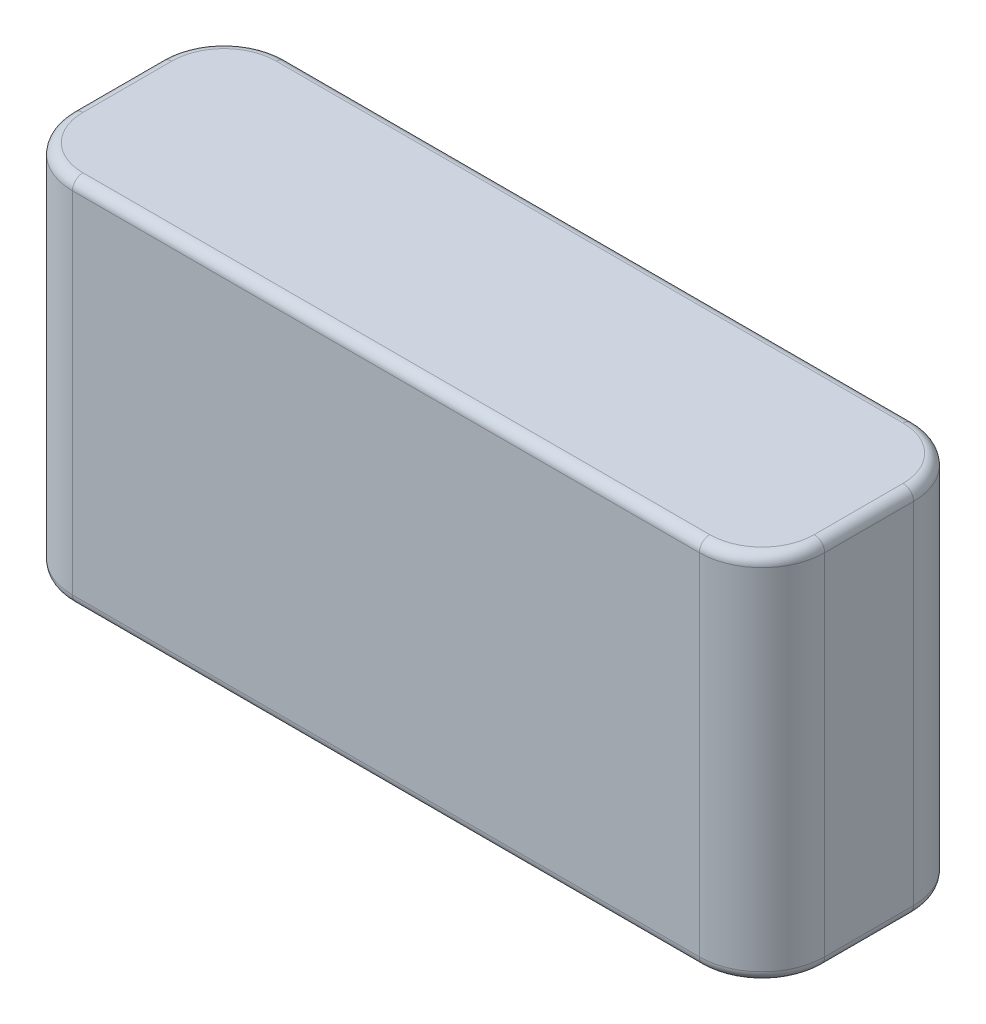
ISO-10303-21;
HEADER;
FILE_DESCRIPTION(('STEP AP214'),'2;1');
FILE_NAME('part.step','',(''),(''),'','','');
FILE_SCHEMA(('AUTOMOTIVE_DESIGN { 1 0 10303 214 1 1 1 1 }'));
ENDSEC;
DATA;
#1=APPLICATION_CONTEXT('core data for automotive mechanical design processes');
#2=APPLICATION_PROTOCOL_DEFINITION('international standard','automotive_design',2000,#1);
#3=PRODUCT_CONTEXT('',#1,'mechanical');
#4=PRODUCT('Part','Part','',(#3));
#5=PRODUCT_RELATED_PRODUCT_CATEGORY('part','',(#4));
#6=PRODUCT_DEFINITION_FORMATION('','',#4);
#7=PRODUCT_DEFINITION_CONTEXT('part definition',#1,'design');
#8=PRODUCT_DEFINITION('design','',#6,#7);
#9=PRODUCT_DEFINITION_SHAPE('','',#8);
#10=(LENGTH_UNIT() NAMED_UNIT(*) SI_UNIT(.MILLI.,.METRE.));
#11=(NAMED_UNIT(*) PLANE_ANGLE_UNIT() SI_UNIT($,.RADIAN.));
#12=(NAMED_UNIT(*) SI_UNIT($,.STERADIAN.) SOLID_ANGLE_UNIT());
#13=UNCERTAINTY_MEASURE_WITH_UNIT(LENGTH_MEASURE(1.E-05),#10,'distance_accuracy_value','');
#14=(GEOMETRIC_REPRESENTATION_CONTEXT(3) GLOBAL_UNCERTAINTY_ASSIGNED_CONTEXT((#13)) GLOBAL_UNIT_ASSIGNED_CONTEXT((#10,
#11,#12)) REPRESENTATION_CONTEXT('',''));
#15=CARTESIAN_POINT('',(0.,0.,0.));
#16=DIRECTION('',(0.,0.,1.));
#17=DIRECTION('',(1.,0.,0.));
#18=AXIS2_PLACEMENT_3D('',#15,#16,#17);
#19=CARTESIAN_POINT('',(36.,-17.75,20.5));
#20=DIRECTION('',(-1.,0.,0.));
#21=DIRECTION('',(0.,0.,1.));
#22=AXIS2_PLACEMENT_3D('',#19,#20,#21);
#23=PLANE('',#22);
#24=DIRECTION('',(0.,1.,0.));
#25=VECTOR('',#24,1.);
#26=CARTESIAN_POINT('',(36.,17.75,6.));
#27=LINE('',#26,#25);
#28=CARTESIAN_POINT('',(36.,-16.75,6.));
#29=VERTEX_POINT('',#28);
#30=CARTESIAN_POINT('',(36.,16.75,6.));
#31=VERTEX_POINT('',#30);
#32=EDGE_CURVE('E176',#29,#31,#27,.T.);
#33=ORIENTED_EDGE('',*,*,#32,.T.);
#34=DIRECTION('',(0.,0.,-1.));
#35=VECTOR('',#34,1.);
#36=CARTESIAN_POINT('',(36.,16.75,20.5));
#37=LINE('',#36,#35);
#38=CARTESIAN_POINT('',(36.,16.75,14.5));
#39=VERTEX_POINT('',#38);
#40=EDGE_CURVE('E197',#31,#39,#37,.F.);
#41=ORIENTED_EDGE('',*,*,#40,.T.);
#42=DIRECTION('',(0.,1.,0.));
#43=VECTOR('',#42,1.);
#44=CARTESIAN_POINT('',(36.,-17.75,14.5));
#45=LINE('',#44,#43);
#46=CARTESIAN_POINT('',(36.,-16.75,14.5));
#47=VERTEX_POINT('',#46);
#48=EDGE_CURVE('E350',#39,#47,#45,.F.);
#49=ORIENTED_EDGE('',*,*,#48,.T.);
#50=DIRECTION('',(0.,0.,-1.));
#51=VECTOR('',#50,1.);
#52=CARTESIAN_POINT('',(36.,-16.75,20.5));
#53=LINE('',#52,#51);
#54=EDGE_CURVE('E194',#47,#29,#53,.T.);
#55=ORIENTED_EDGE('',*,*,#54,.T.);
#56=EDGE_LOOP('',(#33,#41,#49,#55));
#57=FACE_BOUND('',#56,.T.);
#58=ADVANCED_FACE('F40',(#57),#23,.F.);
#59=CARTESIAN_POINT('',(-36.,17.75,20.5));
#60=DIRECTION('',(0.,-1.,0.));
#61=DIRECTION('',(0.,0.,-1.));
#62=AXIS2_PLACEMENT_3D('',#59,#60,#61);
#63=PLANE('',#62);
#64=DIRECTION('',(0.,0.,-1.));
#65=VECTOR('',#64,1.);
#66=CARTESIAN_POINT('',(35.,17.75,20.5));
#67=LINE('',#66,#65);
#68=CARTESIAN_POINT('',(35.,17.75,14.5));
#69=VERTEX_POINT('',#68);
#70=CARTESIAN_POINT('',(35.,17.75,6.));
#71=VERTEX_POINT('',#70);
#72=EDGE_CURVE('E180',#69,#71,#67,.T.);
#73=ORIENTED_EDGE('',*,*,#72,.T.);
#74=CARTESIAN_POINT('',(30.,17.75,6.));
#75=DIRECTION('',(0.,-1.,0.));
#76=DIRECTION('',(0.,0.,-1.));
#77=AXIS2_PLACEMENT_3D('',#74,#75,#76);
#78=CIRCLE('',#77,5.);
#79=CARTESIAN_POINT('',(30.,17.75,1.));
#80=VERTEX_POINT('',#79);
#81=EDGE_CURVE('E159',#71,#80,#78,.F.);
#82=ORIENTED_EDGE('',*,*,#81,.T.);
#83=DIRECTION('',(-1.,0.,0.));
#84=VECTOR('',#83,1.);
#85=CARTESIAN_POINT('',(-30.,17.75,1.));
#86=LINE('',#85,#84);
#87=CARTESIAN_POINT('',(-30.,17.75,1.));
#88=VERTEX_POINT('',#87);
#89=EDGE_CURVE('E168',#80,#88,#86,.T.);
#90=ORIENTED_EDGE('',*,*,#89,.T.);
#91=CARTESIAN_POINT('',(-30.,17.75,6.));
#92=DIRECTION('',(0.,-1.,0.));
#93=DIRECTION('',(0.,0.,-1.));
#94=AXIS2_PLACEMENT_3D('',#91,#92,#93);
#95=CIRCLE('',#94,5.);
#96=CARTESIAN_POINT('',(-35.,17.75,6.));
#97=VERTEX_POINT('',#96);
#98=EDGE_CURVE('E175',#88,#97,#95,.F.);
#99=ORIENTED_EDGE('',*,*,#98,.T.);
#100=DIRECTION('',(0.,0.,-1.));
#101=VECTOR('',#100,1.);
#102=CARTESIAN_POINT('',(-35.,17.75,20.5));
#103=LINE('',#102,#101);
#104=CARTESIAN_POINT('',(-35.,17.75,14.5));
#105=VERTEX_POINT('',#104);
#106=EDGE_CURVE('E358',#97,#105,#103,.F.);
#107=ORIENTED_EDGE('',*,*,#106,.T.);
#108=CARTESIAN_POINT('',(-30.,17.75,14.5));
#109=DIRECTION('',(0.,-1.,0.));
#110=DIRECTION('',(0.,0.,-1.));
#111=AXIS2_PLACEMENT_3D('',#108,#109,#110);
#112=CIRCLE('',#111,5.);
#113=CARTESIAN_POINT('',(-30.,17.75,19.5));
#114=VERTEX_POINT('',#113);
#115=EDGE_CURVE('E361',#105,#114,#112,.F.);
#116=ORIENTED_EDGE('',*,*,#115,.T.);
#117=DIRECTION('',(-1.,0.,0.));
#118=VECTOR('',#117,1.);
#119=CARTESIAN_POINT('',(-36.,17.75,19.5));
#120=LINE('',#119,#118);
#121=CARTESIAN_POINT('',(30.,17.75,19.5));
#122=VERTEX_POINT('',#121);
#123=EDGE_CURVE('E364',#114,#122,#120,.F.);
#124=ORIENTED_EDGE('',*,*,#123,.T.);
#125=CARTESIAN_POINT('',(30.,17.75,14.5));
#126=DIRECTION('',(0.,-1.,0.));
#127=DIRECTION('',(0.,0.,-1.));
#128=AXIS2_PLACEMENT_3D('',#125,#126,#127);
#129=CIRCLE('',#128,5.);
#130=EDGE_CURVE('E188',#122,#69,#129,.F.);
#131=ORIENTED_EDGE('',*,*,#130,.T.);
#132=EDGE_LOOP('',(#73,#82,#90,#99,#107,#116,#124,#131));
#133=FACE_BOUND('',#132,.T.);
#134=ADVANCED_FACE('F178',(#133),#63,.F.);
#135=CARTESIAN_POINT('',(-36.,-17.75,20.5));
#136=DIRECTION('',(1.,0.,0.));
#137=DIRECTION('',(0.,0.,-1.));
#138=AXIS2_PLACEMENT_3D('',#135,#136,#137);
#139=PLANE('',#138);
#140=DIRECTION('',(0.,-1.,0.));
#141=VECTOR('',#140,1.);
#142=CARTESIAN_POINT('',(-36.,-17.75,14.5));
#143=LINE('',#142,#141);
#144=CARTESIAN_POINT('',(-36.,-16.75,14.5));
#145=VERTEX_POINT('',#144);
#146=CARTESIAN_POINT('',(-36.,16.75,14.5));
#147=VERTEX_POINT('',#146);
#148=EDGE_CURVE('E280',#145,#147,#143,.F.);
#149=ORIENTED_EDGE('',*,*,#148,.T.);
#150=DIRECTION('',(0.,0.,-1.));
#151=VECTOR('',#150,1.);
#152=CARTESIAN_POINT('',(-36.,16.75,20.5));
#153=LINE('',#152,#151);
#154=CARTESIAN_POINT('',(-36.,16.75,6.));
#155=VERTEX_POINT('',#154);
#156=EDGE_CURVE('E222',#147,#155,#153,.T.);
#157=ORIENTED_EDGE('',*,*,#156,.T.);
#158=DIRECTION('',(0.,-1.,0.));
#159=VECTOR('',#158,1.);
#160=CARTESIAN_POINT('',(-36.,-17.75,6.));
#161=LINE('',#160,#159);
#162=CARTESIAN_POINT('',(-36.,-16.75,6.));
#163=VERTEX_POINT('',#162);
#164=EDGE_CURVE('E333',#155,#163,#161,.T.);
#165=ORIENTED_EDGE('',*,*,#164,.T.);
#166=DIRECTION('',(0.,0.,-1.));
#167=VECTOR('',#166,1.);
#168=CARTESIAN_POINT('',(-36.,-16.75,20.5));
#169=LINE('',#168,#167);
#170=EDGE_CURVE('E219',#163,#145,#169,.F.);
#171=ORIENTED_EDGE('',*,*,#170,.T.);
#172=EDGE_LOOP('',(#149,#157,#165,#171));
#173=FACE_BOUND('',#172,.T.);
#174=ADVANCED_FACE('F407',(#173),#139,.F.);
#175=CARTESIAN_POINT('',(-36.,-17.75,20.5));
#176=DIRECTION('',(0.,1.,0.));
#177=DIRECTION('',(0.,0.,1.));
#178=AXIS2_PLACEMENT_3D('',#175,#176,#177);
#179=PLANE('',#178);
#180=DIRECTION('',(1.,0.,0.));
#181=VECTOR('',#180,1.);
#182=CARTESIAN_POINT('',(-36.,-17.75,19.5));
#183=LINE('',#182,#181);
#184=CARTESIAN_POINT('',(30.,-17.75,19.5));
#185=VERTEX_POINT('',#184);
#186=CARTESIAN_POINT('',(-30.,-17.75,19.5));
#187=VERTEX_POINT('',#186);
#188=EDGE_CURVE('E50',#185,#187,#183,.F.);
#189=ORIENTED_EDGE('',*,*,#188,.T.);
#190=CARTESIAN_POINT('',(-30.,-17.75,14.5));
#191=DIRECTION('',(0.,1.,0.));
#192=DIRECTION('',(0.,0.,1.));
#193=AXIS2_PLACEMENT_3D('',#190,#191,#192);
#194=CIRCLE('',#193,5.);
#195=CARTESIAN_POINT('',(-35.,-17.75,14.5));
#196=VERTEX_POINT('',#195);
#197=EDGE_CURVE('E11',#187,#196,#194,.F.);
#198=ORIENTED_EDGE('',*,*,#197,.T.);
#199=DIRECTION('',(0.,0.,-1.));
#200=VECTOR('',#199,1.);
#201=CARTESIAN_POINT('',(-35.,-17.75,20.5));
#202=LINE('',#201,#200);
#203=CARTESIAN_POINT('',(-35.,-17.75,6.));
#204=VERTEX_POINT('',#203);
#205=EDGE_CURVE('E237',#196,#204,#202,.T.);
#206=ORIENTED_EDGE('',*,*,#205,.T.);
#207=CARTESIAN_POINT('',(-30.,-17.75,6.));
#208=DIRECTION('',(0.,1.,0.));
#209=DIRECTION('',(0.,0.,1.));
#210=AXIS2_PLACEMENT_3D('',#207,#208,#209);
#211=CIRCLE('',#210,5.);
#212=CARTESIAN_POINT('',(-30.,-17.75,1.));
#213=VERTEX_POINT('',#212);
#214=EDGE_CURVE('E240',#204,#213,#211,.F.);
#215=ORIENTED_EDGE('',*,*,#214,.T.);
#216=DIRECTION('',(1.,0.,0.));
#217=VECTOR('',#216,1.);
#218=CARTESIAN_POINT('',(30.,-17.75,1.));
#219=LINE('',#218,#217);
#220=CARTESIAN_POINT('',(30.,-17.75,1.));
#221=VERTEX_POINT('',#220);
#222=EDGE_CURVE('E243',#213,#221,#219,.T.);
#223=ORIENTED_EDGE('',*,*,#222,.T.);
#224=CARTESIAN_POINT('',(30.,-17.75,6.));
#225=DIRECTION('',(0.,1.,0.));
#226=DIRECTION('',(0.,0.,1.));
#227=AXIS2_PLACEMENT_3D('',#224,#225,#226);
#228=CIRCLE('',#227,5.);
#229=CARTESIAN_POINT('',(35.,-17.75,6.));
#230=VERTEX_POINT('',#229);
#231=EDGE_CURVE('E246',#221,#230,#228,.F.);
#232=ORIENTED_EDGE('',*,*,#231,.T.);
#233=DIRECTION('',(0.,0.,-1.));
#234=VECTOR('',#233,1.);
#235=CARTESIAN_POINT('',(35.,-17.75,20.5));
#236=LINE('',#235,#234);
#237=CARTESIAN_POINT('',(35.,-17.75,14.5));
#238=VERTEX_POINT('',#237);
#239=EDGE_CURVE('E249',#230,#238,#236,.F.);
#240=ORIENTED_EDGE('',*,*,#239,.T.);
#241=CARTESIAN_POINT('',(30.,-17.75,14.5));
#242=DIRECTION('',(0.,1.,0.));
#243=DIRECTION('',(0.,0.,1.));
#244=AXIS2_PLACEMENT_3D('',#241,#242,#243);
#245=CIRCLE('',#244,5.);
#246=EDGE_CURVE('E61',#238,#185,#245,.F.);
#247=ORIENTED_EDGE('',*,*,#246,.T.);
#248=EDGE_LOOP('',(#189,#198,#206,#215,#223,#232,#240,#247));
#249=FACE_BOUND('',#248,.T.);
#250=ADVANCED_FACE('F394',(#249),#179,.F.);
#251=CARTESIAN_POINT('',(0.,0.,20.5));
#252=DIRECTION('',(0.,0.,-1.));
#253=DIRECTION('',(-1.,0.,0.));
#254=AXIS2_PLACEMENT_3D('',#251,#252,#253);
#255=PLANE('',#254);
#256=DIRECTION('',(0.,1.,0.));
#257=VECTOR('',#256,1.);
#258=CARTESIAN_POINT('',(30.,0.,20.5));
#259=LINE('',#258,#257);
#260=CARTESIAN_POINT('',(30.,-16.75,20.5));
#261=VERTEX_POINT('',#260);
#262=CARTESIAN_POINT('',(30.,16.75,20.5));
#263=VERTEX_POINT('',#262);
#264=EDGE_CURVE('E337',#261,#263,#259,.T.);
#265=ORIENTED_EDGE('',*,*,#264,.T.);
#266=DIRECTION('',(-1.,0.,0.));
#267=VECTOR('',#266,1.);
#268=CARTESIAN_POINT('',(0.,16.75,20.5));
#269=LINE('',#268,#267);
#270=CARTESIAN_POINT('',(-30.,16.75,20.5));
#271=VERTEX_POINT('',#270);
#272=EDGE_CURVE('E209',#263,#271,#269,.T.);
#273=ORIENTED_EDGE('',*,*,#272,.T.);
#274=DIRECTION('',(0.,-1.,0.));
#275=VECTOR('',#274,1.);
#276=CARTESIAN_POINT('',(-30.,0.,20.5));
#277=LINE('',#276,#275);
#278=CARTESIAN_POINT('',(-30.,-16.75,20.5));
#279=VERTEX_POINT('',#278);
#280=EDGE_CURVE('E346',#271,#279,#277,.T.);
#281=ORIENTED_EDGE('',*,*,#280,.T.);
#282=DIRECTION('',(1.,0.,0.));
#283=VECTOR('',#282,1.);
#284=CARTESIAN_POINT('',(0.,-16.75,20.5));
#285=LINE('',#284,#283);
#286=EDGE_CURVE('E206',#279,#261,#285,.T.);
#287=ORIENTED_EDGE('',*,*,#286,.T.);
#288=EDGE_LOOP('',(#265,#273,#281,#287));
#289=FACE_BOUND('',#288,.T.);
#290=ADVANCED_FACE('F424',(#289),#255,.F.);
#291=CARTESIAN_POINT('',(0.,0.,0.));
#292=DIRECTION('',(0.,0.,-1.));
#293=DIRECTION('',(-1.,0.,0.));
#294=AXIS2_PLACEMENT_3D('',#291,#292,#293);
#295=PLANE('',#294);
#296=DIRECTION('',(0.,-1.,0.));
#297=VECTOR('',#296,1.);
#298=CARTESIAN_POINT('',(-30.,17.75,0.));
#299=LINE('',#298,#297);
#300=CARTESIAN_POINT('',(-30.,-16.75,0.));
#301=VERTEX_POINT('',#300);
#302=CARTESIAN_POINT('',(-30.,16.75,0.));
#303=VERTEX_POINT('',#302);
#304=EDGE_CURVE('E332',#301,#303,#299,.F.);
#305=ORIENTED_EDGE('',*,*,#304,.T.);
#306=DIRECTION('',(-1.,0.,0.));
#307=VECTOR('',#306,1.);
#308=CARTESIAN_POINT('',(30.,16.75,0.));
#309=LINE('',#308,#307);
#310=CARTESIAN_POINT('',(30.,16.75,0.));
#311=VERTEX_POINT('',#310);
#312=EDGE_CURVE('E234',#303,#311,#309,.F.);
#313=ORIENTED_EDGE('',*,*,#312,.T.);
#314=DIRECTION('',(0.,1.,0.));
#315=VECTOR('',#314,1.);
#316=CARTESIAN_POINT('',(30.,-17.75,0.));
#317=LINE('',#316,#315);
#318=CARTESIAN_POINT('',(30.,-16.75,0.));
#319=VERTEX_POINT('',#318);
#320=EDGE_CURVE('E325',#311,#319,#317,.F.);
#321=ORIENTED_EDGE('',*,*,#320,.T.);
#322=DIRECTION('',(1.,0.,0.));
#323=VECTOR('',#322,1.);
#324=CARTESIAN_POINT('',(-30.,-16.75,0.));
#325=LINE('',#324,#323);
#326=EDGE_CURVE('E231',#319,#301,#325,.F.);
#327=ORIENTED_EDGE('',*,*,#326,.T.);
#328=EDGE_LOOP('',(#305,#313,#321,#327));
#329=FACE_BOUND('',#328,.T.);
#330=ADVANCED_FACE('F329',(#329),#295,.T.);
#331=CARTESIAN_POINT('',(-30.,-17.75,6.));
#332=DIRECTION('',(0.,1.,0.));
#333=DIRECTION('',(0.,0.,1.));
#334=AXIS2_PLACEMENT_3D('',#331,#332,#333);
#335=CYLINDRICAL_SURFACE('',#334,6.);
#336=ORIENTED_EDGE('',*,*,#164,.F.);
#337=CARTESIAN_POINT('',(-30.,16.75,6.));
#338=DIRECTION('',(0.,-1.,0.));
#339=DIRECTION('',(0.,0.,-1.));
#340=AXIS2_PLACEMENT_3D('',#337,#338,#339);
#341=CIRCLE('',#340,6.);
#342=EDGE_CURVE('E228',#155,#303,#341,.T.);
#343=ORIENTED_EDGE('',*,*,#342,.T.);
#344=ORIENTED_EDGE('',*,*,#304,.F.);
#345=CARTESIAN_POINT('',(-30.,-16.75,6.));
#346=DIRECTION('',(0.,1.,0.));
#347=DIRECTION('',(0.,0.,1.));
#348=AXIS2_PLACEMENT_3D('',#345,#346,#347);
#349=CIRCLE('',#348,6.);
#350=EDGE_CURVE('E225',#301,#163,#349,.T.);
#351=ORIENTED_EDGE('',*,*,#350,.T.);
#352=EDGE_LOOP('',(#336,#343,#344,#351));
#353=FACE_BOUND('',#352,.T.);
#354=ADVANCED_FACE('F432',(#353),#335,.T.);
#355=CARTESIAN_POINT('',(-30.,0.,14.5));
#356=DIRECTION('',(0.,-1.,0.));
#357=DIRECTION('',(0.,0.,-1.));
#358=AXIS2_PLACEMENT_3D('',#355,#356,#357);
#359=CYLINDRICAL_SURFACE('',#358,6.);
#360=ORIENTED_EDGE('',*,*,#280,.F.);
#361=CARTESIAN_POINT('',(-30.,16.75,14.5));
#362=DIRECTION('',(0.,-1.,0.));
#363=DIRECTION('',(0.,0.,-1.));
#364=AXIS2_PLACEMENT_3D('',#361,#362,#363);
#365=CIRCLE('',#364,6.);
#366=EDGE_CURVE('E216',#271,#147,#365,.T.);
#367=ORIENTED_EDGE('',*,*,#366,.T.);
#368=ORIENTED_EDGE('',*,*,#148,.F.);
#369=CARTESIAN_POINT('',(-30.,-16.75,14.5));
#370=DIRECTION('',(0.,1.,0.));
#371=DIRECTION('',(0.,0.,1.));
#372=AXIS2_PLACEMENT_3D('',#369,#370,#371);
#373=CIRCLE('',#372,6.);
#374=EDGE_CURVE('E212',#145,#279,#373,.T.);
#375=ORIENTED_EDGE('',*,*,#374,.T.);
#376=EDGE_LOOP('',(#360,#367,#368,#375));
#377=FACE_BOUND('',#376,.T.);
#378=ADVANCED_FACE('F412',(#377),#359,.T.);
#379=CARTESIAN_POINT('',(30.,-17.75,6.));
#380=DIRECTION('',(0.,-1.,0.));
#381=DIRECTION('',(0.,0.,-1.));
#382=AXIS2_PLACEMENT_3D('',#379,#380,#381);
#383=CYLINDRICAL_SURFACE('',#382,6.);
#384=ORIENTED_EDGE('',*,*,#320,.F.);
#385=CARTESIAN_POINT('',(30.,16.75,6.));
#386=DIRECTION('',(0.,-1.,0.));
#387=DIRECTION('',(0.,0.,-1.));
#388=AXIS2_PLACEMENT_3D('',#385,#386,#387);
#389=CIRCLE('',#388,6.);
#390=EDGE_CURVE('E161',#311,#31,#389,.T.);
#391=ORIENTED_EDGE('',*,*,#390,.T.);
#392=ORIENTED_EDGE('',*,*,#32,.F.);
#393=CARTESIAN_POINT('',(30.,-16.75,6.));
#394=DIRECTION('',(0.,1.,0.));
#395=DIRECTION('',(0.,0.,1.));
#396=AXIS2_PLACEMENT_3D('',#393,#394,#395);
#397=CIRCLE('',#396,6.);
#398=EDGE_CURVE('E183',#29,#319,#397,.T.);
#399=ORIENTED_EDGE('',*,*,#398,.T.);
#400=EDGE_LOOP('',(#384,#391,#392,#399));
#401=FACE_BOUND('',#400,.T.);
#402=ADVANCED_FACE('F324',(#401),#383,.T.);
#403=CARTESIAN_POINT('',(30.,0.,14.5));
#404=DIRECTION('',(0.,1.,0.));
#405=DIRECTION('',(0.,0.,1.));
#406=AXIS2_PLACEMENT_3D('',#403,#404,#405);
#407=CYLINDRICAL_SURFACE('',#406,6.);
#408=ORIENTED_EDGE('',*,*,#48,.F.);
#409=CARTESIAN_POINT('',(30.,16.75,14.5));
#410=DIRECTION('',(0.,-1.,0.));
#411=DIRECTION('',(0.,0.,-1.));
#412=AXIS2_PLACEMENT_3D('',#409,#410,#411);
#413=CIRCLE('',#412,6.);
#414=EDGE_CURVE('E203',#39,#263,#413,.T.);
#415=ORIENTED_EDGE('',*,*,#414,.T.);
#416=ORIENTED_EDGE('',*,*,#264,.F.);
#417=CARTESIAN_POINT('',(30.,-16.75,14.5));
#418=DIRECTION('',(0.,1.,0.));
#419=DIRECTION('',(0.,0.,1.));
#420=AXIS2_PLACEMENT_3D('',#417,#418,#419);
#421=CIRCLE('',#420,6.);
#422=EDGE_CURVE('E200',#261,#47,#421,.T.);
#423=ORIENTED_EDGE('',*,*,#422,.T.);
#424=EDGE_LOOP('',(#408,#415,#416,#423));
#425=FACE_BOUND('',#424,.T.);
#426=ADVANCED_FACE('F380',(#425),#407,.T.);
#427=CARTESIAN_POINT('',(-30.,16.75,14.5));
#428=DIRECTION('',(0.,-1.,0.));
#429=DIRECTION('',(0.,0.,-1.));
#430=AXIS2_PLACEMENT_3D('',#427,#428,#429);
#431=TOROIDAL_SURFACE('',#430,5.,1.);
#432=CARTESIAN_POINT('',(-35.,16.75,14.5));
#433=DIRECTION('',(0.,0.,-1.));
#434=DIRECTION('',(-1.,0.,0.));
#435=AXIS2_PLACEMENT_3D('',#432,#433,#434);
#436=CIRCLE('',#435,1.);
#437=EDGE_CURVE('E272',#147,#105,#436,.T.);
#438=ORIENTED_EDGE('',*,*,#437,.F.);
#439=ORIENTED_EDGE('',*,*,#366,.F.);
#440=CARTESIAN_POINT('',(-30.,16.75,19.5));
#441=DIRECTION('',(1.,0.,0.));
#442=DIRECTION('',(0.,0.,-1.));
#443=AXIS2_PLACEMENT_3D('',#440,#441,#442);
#444=CIRCLE('',#443,1.);
#445=EDGE_CURVE('E276',#114,#271,#444,.T.);
#446=ORIENTED_EDGE('',*,*,#445,.F.);
#447=ORIENTED_EDGE('',*,*,#115,.F.);
#448=EDGE_LOOP('',(#438,#439,#446,#447));
#449=FACE_BOUND('',#448,.T.);
#450=ADVANCED_FACE('F417',(#449),#431,.T.);
#451=CARTESIAN_POINT('',(0.,16.75,19.5));
#452=DIRECTION('',(-1.,0.,0.));
#453=DIRECTION('',(0.,0.,1.));
#454=AXIS2_PLACEMENT_3D('',#451,#452,#453);
#455=CYLINDRICAL_SURFACE('',#454,1.);
#456=ORIENTED_EDGE('',*,*,#445,.T.);
#457=ORIENTED_EDGE('',*,*,#272,.F.);
#458=CARTESIAN_POINT('',(30.,16.75,19.5));
#459=DIRECTION('',(1.,0.,0.));
#460=DIRECTION('',(0.,0.,-1.));
#461=AXIS2_PLACEMENT_3D('',#458,#459,#460);
#462=CIRCLE('',#461,1.);
#463=EDGE_CURVE('E268',#122,#263,#462,.T.);
#464=ORIENTED_EDGE('',*,*,#463,.F.);
#465=ORIENTED_EDGE('',*,*,#123,.F.);
#466=EDGE_LOOP('',(#456,#457,#464,#465));
#467=FACE_BOUND('',#466,.T.);
#468=ADVANCED_FACE('F422',(#467),#455,.T.);
#469=CARTESIAN_POINT('',(-35.,16.75,20.5));
#470=DIRECTION('',(0.,0.,-1.));
#471=DIRECTION('',(-1.,0.,0.));
#472=AXIS2_PLACEMENT_3D('',#469,#470,#471);
#473=CYLINDRICAL_SURFACE('',#472,1.);
#474=ORIENTED_EDGE('',*,*,#437,.T.);
#475=ORIENTED_EDGE('',*,*,#106,.F.);
#476=CARTESIAN_POINT('',(-35.,16.75,6.));
#477=DIRECTION('',(0.,0.,-1.));
#478=DIRECTION('',(-1.,0.,0.));
#479=AXIS2_PLACEMENT_3D('',#476,#477,#478);
#480=CIRCLE('',#479,1.);
#481=EDGE_CURVE('E264',#155,#97,#480,.T.);
#482=ORIENTED_EDGE('',*,*,#481,.F.);
#483=ORIENTED_EDGE('',*,*,#156,.F.);
#484=EDGE_LOOP('',(#474,#475,#482,#483));
#485=FACE_BOUND('',#484,.T.);
#486=ADVANCED_FACE('F465',(#485),#473,.T.);
#487=CARTESIAN_POINT('',(30.,16.75,14.5));
#488=DIRECTION('',(0.,-1.,0.));
#489=DIRECTION('',(0.,0.,-1.));
#490=AXIS2_PLACEMENT_3D('',#487,#488,#489);
#491=TOROIDAL_SURFACE('',#490,5.,1.);
#492=ORIENTED_EDGE('',*,*,#463,.T.);
#493=ORIENTED_EDGE('',*,*,#414,.F.);
#494=CARTESIAN_POINT('',(35.,16.75,14.5));
#495=DIRECTION('',(0.,0.,-1.));
#496=DIRECTION('',(-1.,0.,0.));
#497=AXIS2_PLACEMENT_3D('',#494,#495,#496);
#498=CIRCLE('',#497,1.);
#499=EDGE_CURVE('E260',#69,#39,#498,.T.);
#500=ORIENTED_EDGE('',*,*,#499,.F.);
#501=ORIENTED_EDGE('',*,*,#130,.F.);
#502=EDGE_LOOP('',(#492,#493,#500,#501));
#503=FACE_BOUND('',#502,.T.);
#504=ADVANCED_FACE('F373',(#503),#491,.T.);
#505=CARTESIAN_POINT('',(-30.,16.75,6.));
#506=DIRECTION('',(0.,-1.,0.));
#507=DIRECTION('',(0.,0.,-1.));
#508=AXIS2_PLACEMENT_3D('',#505,#506,#507);
#509=TOROIDAL_SURFACE('',#508,5.,1.);
#510=ORIENTED_EDGE('',*,*,#481,.T.);
#511=ORIENTED_EDGE('',*,*,#98,.F.);
#512=CARTESIAN_POINT('',(-30.,16.75,1.));
#513=DIRECTION('',(1.,0.,0.));
#514=DIRECTION('',(0.,0.,-1.));
#515=AXIS2_PLACEMENT_3D('',#512,#513,#514);
#516=CIRCLE('',#515,1.);
#517=EDGE_CURVE('E171',#303,#88,#516,.T.);
#518=ORIENTED_EDGE('',*,*,#517,.F.);
#519=ORIENTED_EDGE('',*,*,#342,.F.);
#520=EDGE_LOOP('',(#510,#511,#518,#519));
#521=FACE_BOUND('',#520,.T.);
#522=ADVANCED_FACE('F459',(#521),#509,.T.);
#523=CARTESIAN_POINT('',(35.,16.75,20.5));
#524=DIRECTION('',(0.,0.,-1.));
#525=DIRECTION('',(-1.,0.,0.));
#526=AXIS2_PLACEMENT_3D('',#523,#524,#525);
#527=CYLINDRICAL_SURFACE('',#526,1.);
#528=ORIENTED_EDGE('',*,*,#499,.T.);
#529=ORIENTED_EDGE('',*,*,#40,.F.);
#530=CARTESIAN_POINT('',(35.,16.75,6.));
#531=DIRECTION('',(0.,0.,-1.));
#532=DIRECTION('',(-1.,0.,0.));
#533=AXIS2_PLACEMENT_3D('',#530,#531,#532);
#534=CIRCLE('',#533,1.);
#535=EDGE_CURVE('E165',#71,#31,#534,.T.);
#536=ORIENTED_EDGE('',*,*,#535,.F.);
#537=ORIENTED_EDGE('',*,*,#72,.F.);
#538=EDGE_LOOP('',(#528,#529,#536,#537));
#539=FACE_BOUND('',#538,.T.);
#540=ADVANCED_FACE('F376',(#539),#527,.T.);
#541=CARTESIAN_POINT('',(-36.,16.75,1.));
#542=DIRECTION('',(1.,0.,0.));
#543=DIRECTION('',(0.,0.,-1.));
#544=AXIS2_PLACEMENT_3D('',#541,#542,#543);
#545=CYLINDRICAL_SURFACE('',#544,1.);
#546=ORIENTED_EDGE('',*,*,#517,.T.);
#547=ORIENTED_EDGE('',*,*,#89,.F.);
#548=CARTESIAN_POINT('',(30.,16.75,1.));
#549=DIRECTION('',(1.,0.,0.));
#550=DIRECTION('',(0.,0.,-1.));
#551=AXIS2_PLACEMENT_3D('',#548,#549,#550);
#552=CIRCLE('',#551,1.);
#553=EDGE_CURVE('E155',#311,#80,#552,.T.);
#554=ORIENTED_EDGE('',*,*,#553,.F.);
#555=ORIENTED_EDGE('',*,*,#312,.F.);
#556=EDGE_LOOP('',(#546,#547,#554,#555));
#557=FACE_BOUND('',#556,.T.);
#558=ADVANCED_FACE('F169',(#557),#545,.T.);
#559=CARTESIAN_POINT('',(30.,16.75,6.));
#560=DIRECTION('',(0.,-1.,0.));
#561=DIRECTION('',(0.,0.,-1.));
#562=AXIS2_PLACEMENT_3D('',#559,#560,#561);
#563=TOROIDAL_SURFACE('',#562,5.,1.);
#564=ORIENTED_EDGE('',*,*,#535,.T.);
#565=ORIENTED_EDGE('',*,*,#390,.F.);
#566=ORIENTED_EDGE('',*,*,#553,.T.);
#567=ORIENTED_EDGE('',*,*,#81,.F.);
#568=EDGE_LOOP('',(#564,#565,#566,#567));
#569=FACE_BOUND('',#568,.T.);
#570=ADVANCED_FACE('F157',(#569),#563,.T.);
#571=CARTESIAN_POINT('',(30.,-16.75,6.));
#572=DIRECTION('',(0.,1.,0.));
#573=DIRECTION('',(0.,0.,1.));
#574=AXIS2_PLACEMENT_3D('',#571,#572,#573);
#575=TOROIDAL_SURFACE('',#574,5.,1.);
#576=CARTESIAN_POINT('',(30.,-16.75,1.));
#577=DIRECTION('',(-1.,0.,0.));
#578=DIRECTION('',(0.,0.,1.));
#579=AXIS2_PLACEMENT_3D('',#576,#577,#578);
#580=CIRCLE('',#579,1.);
#581=EDGE_CURVE('E302',#319,#221,#580,.T.);
#582=ORIENTED_EDGE('',*,*,#581,.F.);
#583=ORIENTED_EDGE('',*,*,#398,.F.);
#584=CARTESIAN_POINT('',(35.,-16.75,6.));
#585=DIRECTION('',(0.,0.,1.));
#586=DIRECTION('',(1.,0.,0.));
#587=AXIS2_PLACEMENT_3D('',#584,#585,#586);
#588=CIRCLE('',#587,1.);
#589=EDGE_CURVE('E44',#230,#29,#588,.T.);
#590=ORIENTED_EDGE('',*,*,#589,.F.);
#591=ORIENTED_EDGE('',*,*,#231,.F.);
#592=EDGE_LOOP('',(#582,#583,#590,#591));
#593=FACE_BOUND('',#592,.T.);
#594=ADVANCED_FACE('F42',(#593),#575,.T.);
#595=CARTESIAN_POINT('',(35.,-16.75,20.5));
#596=DIRECTION('',(0.,0.,-1.));
#597=DIRECTION('',(-1.,0.,0.));
#598=AXIS2_PLACEMENT_3D('',#595,#596,#597);
#599=CYLINDRICAL_SURFACE('',#598,1.);
#600=ORIENTED_EDGE('',*,*,#589,.T.);
#601=ORIENTED_EDGE('',*,*,#54,.F.);
#602=CARTESIAN_POINT('',(35.,-16.75,14.5));
#603=DIRECTION('',(0.,0.,1.));
#604=DIRECTION('',(1.,0.,0.));
#605=AXIS2_PLACEMENT_3D('',#602,#603,#604);
#606=CIRCLE('',#605,1.);
#607=EDGE_CURVE('E299',#238,#47,#606,.T.);
#608=ORIENTED_EDGE('',*,*,#607,.F.);
#609=ORIENTED_EDGE('',*,*,#239,.F.);
#610=EDGE_LOOP('',(#600,#601,#608,#609));
#611=FACE_BOUND('',#610,.T.);
#612=ADVANCED_FACE('F315',(#611),#599,.T.);
#613=CARTESIAN_POINT('',(-36.,-16.75,1.));
#614=DIRECTION('',(-1.,0.,0.));
#615=DIRECTION('',(0.,0.,1.));
#616=AXIS2_PLACEMENT_3D('',#613,#614,#615);
#617=CYLINDRICAL_SURFACE('',#616,1.);
#618=ORIENTED_EDGE('',*,*,#581,.T.);
#619=ORIENTED_EDGE('',*,*,#222,.F.);
#620=CARTESIAN_POINT('',(-30.,-16.75,1.));
#621=DIRECTION('',(-1.,0.,0.));
#622=DIRECTION('',(0.,0.,1.));
#623=AXIS2_PLACEMENT_3D('',#620,#621,#622);
#624=CIRCLE('',#623,1.);
#625=EDGE_CURVE('E295',#301,#213,#624,.T.);
#626=ORIENTED_EDGE('',*,*,#625,.F.);
#627=ORIENTED_EDGE('',*,*,#326,.F.);
#628=EDGE_LOOP('',(#618,#619,#626,#627));
#629=FACE_BOUND('',#628,.T.);
#630=ADVANCED_FACE('F483',(#629),#617,.T.);
#631=CARTESIAN_POINT('',(30.,-16.75,14.5));
#632=DIRECTION('',(0.,1.,0.));
#633=DIRECTION('',(0.,0.,1.));
#634=AXIS2_PLACEMENT_3D('',#631,#632,#633);
#635=TOROIDAL_SURFACE('',#634,5.,1.);
#636=ORIENTED_EDGE('',*,*,#607,.T.);
#637=ORIENTED_EDGE('',*,*,#422,.F.);
#638=CARTESIAN_POINT('',(30.,-16.75,19.5));
#639=DIRECTION('',(-1.,0.,0.));
#640=DIRECTION('',(0.,0.,1.));
#641=AXIS2_PLACEMENT_3D('',#638,#639,#640);
#642=CIRCLE('',#641,1.);
#643=EDGE_CURVE('E291',#185,#261,#642,.T.);
#644=ORIENTED_EDGE('',*,*,#643,.F.);
#645=ORIENTED_EDGE('',*,*,#246,.F.);
#646=EDGE_LOOP('',(#636,#637,#644,#645));
#647=FACE_BOUND('',#646,.T.);
#648=ADVANCED_FACE('F384',(#647),#635,.T.);
#649=CARTESIAN_POINT('',(-30.,-16.75,6.));
#650=DIRECTION('',(0.,1.,0.));
#651=DIRECTION('',(0.,0.,1.));
#652=AXIS2_PLACEMENT_3D('',#649,#650,#651);
#653=TOROIDAL_SURFACE('',#652,5.,1.);
#654=ORIENTED_EDGE('',*,*,#625,.T.);
#655=ORIENTED_EDGE('',*,*,#214,.F.);
#656=CARTESIAN_POINT('',(-35.,-16.75,6.));
#657=DIRECTION('',(0.,0.,1.));
#658=DIRECTION('',(1.,0.,0.));
#659=AXIS2_PLACEMENT_3D('',#656,#657,#658);
#660=CIRCLE('',#659,1.);
#661=EDGE_CURVE('E287',#163,#204,#660,.T.);
#662=ORIENTED_EDGE('',*,*,#661,.F.);
#663=ORIENTED_EDGE('',*,*,#350,.F.);
#664=EDGE_LOOP('',(#654,#655,#662,#663));
#665=FACE_BOUND('',#664,.T.);
#666=ADVANCED_FACE('F399',(#665),#653,.T.);
#667=CARTESIAN_POINT('',(0.,-16.75,19.5));
#668=DIRECTION('',(1.,0.,0.));
#669=DIRECTION('',(0.,0.,-1.));
#670=AXIS2_PLACEMENT_3D('',#667,#668,#669);
#671=CYLINDRICAL_SURFACE('',#670,1.);
#672=ORIENTED_EDGE('',*,*,#643,.T.);
#673=ORIENTED_EDGE('',*,*,#286,.F.);
#674=CARTESIAN_POINT('',(-30.,-16.75,19.5));
#675=DIRECTION('',(-1.,0.,0.));
#676=DIRECTION('',(0.,0.,1.));
#677=AXIS2_PLACEMENT_3D('',#674,#675,#676);
#678=CIRCLE('',#677,1.);
#679=EDGE_CURVE('E284',#187,#279,#678,.T.);
#680=ORIENTED_EDGE('',*,*,#679,.F.);
#681=ORIENTED_EDGE('',*,*,#188,.F.);
#682=EDGE_LOOP('',(#672,#673,#680,#681));
#683=FACE_BOUND('',#682,.T.);
#684=ADVANCED_FACE('F387',(#683),#671,.T.);
#685=CARTESIAN_POINT('',(-35.,-16.75,20.5));
#686=DIRECTION('',(0.,0.,-1.));
#687=DIRECTION('',(-1.,0.,0.));
#688=AXIS2_PLACEMENT_3D('',#685,#686,#687);
#689=CYLINDRICAL_SURFACE('',#688,1.);
#690=ORIENTED_EDGE('',*,*,#661,.T.);
#691=ORIENTED_EDGE('',*,*,#205,.F.);
#692=CARTESIAN_POINT('',(-35.,-16.75,14.5));
#693=DIRECTION('',(0.,0.,1.));
#694=DIRECTION('',(1.,0.,0.));
#695=AXIS2_PLACEMENT_3D('',#692,#693,#694);
#696=CIRCLE('',#695,1.);
#697=EDGE_CURVE('E281',#145,#196,#696,.T.);
#698=ORIENTED_EDGE('',*,*,#697,.F.);
#699=ORIENTED_EDGE('',*,*,#170,.F.);
#700=EDGE_LOOP('',(#690,#691,#698,#699));
#701=FACE_BOUND('',#700,.T.);
#702=ADVANCED_FACE('F403',(#701),#689,.T.);
#703=CARTESIAN_POINT('',(-30.,-16.75,14.5));
#704=DIRECTION('',(0.,1.,0.));
#705=DIRECTION('',(0.,0.,1.));
#706=AXIS2_PLACEMENT_3D('',#703,#704,#705);
#707=TOROIDAL_SURFACE('',#706,5.,1.);
#708=ORIENTED_EDGE('',*,*,#679,.T.);
#709=ORIENTED_EDGE('',*,*,#374,.F.);
#710=ORIENTED_EDGE('',*,*,#697,.T.);
#711=ORIENTED_EDGE('',*,*,#197,.F.);
#712=EDGE_LOOP('',(#708,#709,#710,#711));
#713=FACE_BOUND('',#712,.T.);
#714=ADVANCED_FACE('F391',(#713),#707,.T.);
#715=CLOSED_SHELL('',(#58,#134,#174,#250,#290,#330,#354,#378,#402,#426,#450,#468,#486,#504,#522,
#540,#558,#570,#594,#612,#630,#648,#666,#684,#702,#714));
#716=MANIFOLD_SOLID_BREP('B2',#715);
#717=ADVANCED_BREP_SHAPE_REPRESENTATION('',(#18,#716),#14);
#718=SHAPE_DEFINITION_REPRESENTATION(#9,#717);
ENDSEC;
END-ISO-10303-21;
